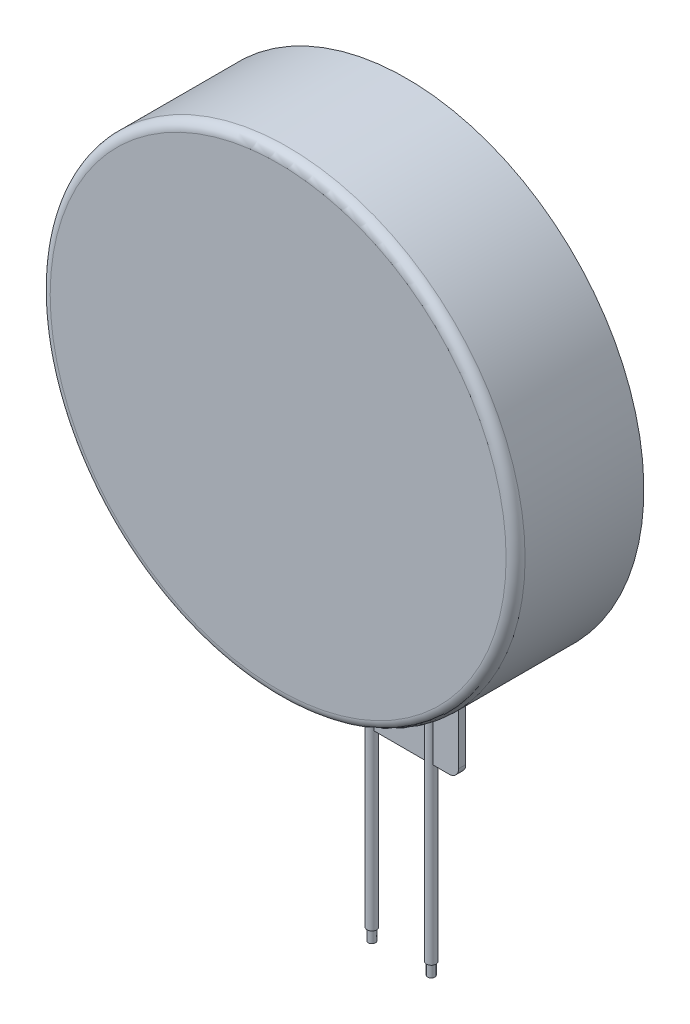
ISO-10303-21;
HEADER;
FILE_DESCRIPTION(('STEP AP214'),'2;1');
FILE_NAME('part.step','',(''),(''),'','','');
FILE_SCHEMA(('AUTOMOTIVE_DESIGN { 1 0 10303 214 1 1 1 1 }'));
ENDSEC;
DATA;
#1=APPLICATION_CONTEXT('core data for automotive mechanical design processes');
#2=APPLICATION_PROTOCOL_DEFINITION('international standard','automotive_design',2000,#1);
#3=PRODUCT_CONTEXT('',#1,'mechanical');
#4=PRODUCT('Part','Part','',(#3));
#5=PRODUCT_RELATED_PRODUCT_CATEGORY('part','',(#4));
#6=PRODUCT_DEFINITION_FORMATION('','',#4);
#7=PRODUCT_DEFINITION_CONTEXT('part definition',#1,'design');
#8=PRODUCT_DEFINITION('design','',#6,#7);
#9=PRODUCT_DEFINITION_SHAPE('','',#8);
#10=(LENGTH_UNIT() NAMED_UNIT(*) SI_UNIT(.MILLI.,.METRE.));
#11=(NAMED_UNIT(*) PLANE_ANGLE_UNIT() SI_UNIT($,.RADIAN.));
#12=(NAMED_UNIT(*) SI_UNIT($,.STERADIAN.) SOLID_ANGLE_UNIT());
#13=UNCERTAINTY_MEASURE_WITH_UNIT(LENGTH_MEASURE(1.E-05),#10,'distance_accuracy_value','');
#14=(GEOMETRIC_REPRESENTATION_CONTEXT(3) GLOBAL_UNCERTAINTY_ASSIGNED_CONTEXT((#13)) GLOBAL_UNIT_ASSIGNED_CONTEXT((#10,
#11,#12)) REPRESENTATION_CONTEXT('',''));
#15=CARTESIAN_POINT('',(0.,0.,0.));
#16=DIRECTION('',(0.,0.,1.));
#17=DIRECTION('',(1.,0.,0.));
#18=AXIS2_PLACEMENT_3D('',#15,#16,#17);
#19=CARTESIAN_POINT('',(0.625,-4.89122918275927,0.101));
#20=DIRECTION('',(0.,-1.,0.));
#21=DIRECTION('',(0.,0.,-1.));
#22=AXIS2_PLACEMENT_3D('',#19,#20,#21);
#23=CYLINDRICAL_SURFACE('',#22,0.101);
#24=CARTESIAN_POINT('',(0.625,-4.89122918275927,0.101));
#25=DIRECTION('',(0.,-1.,0.));
#26=DIRECTION('',(0.,0.,-1.));
#27=AXIS2_PLACEMENT_3D('',#24,#25,#26);
#28=CIRCLE('',#27,0.101);
#29=CARTESIAN_POINT('',(0.625,-4.89122918275927,0.));
#30=VERTEX_POINT('',#29);
#31=EDGE_CURVE('E12',#30,#30,#28,.T.);
#32=ORIENTED_EDGE('',*,*,#31,.T.);
#33=EDGE_LOOP('',(#32));
#34=FACE_BOUND('',#33,.T.);
#35=CARTESIAN_POINT('',(0.625,-10.7412291827593,0.101));
#36=DIRECTION('',(0.,-1.,0.));
#37=DIRECTION('',(0.,0.,-1.));
#38=AXIS2_PLACEMENT_3D('',#35,#36,#37);
#39=CIRCLE('',#38,0.101);
#40=CARTESIAN_POINT('',(0.625,-10.7412291827593,0.));
#41=VERTEX_POINT('',#40);
#42=EDGE_CURVE('E51',#41,#41,#39,.F.);
#43=ORIENTED_EDGE('',*,*,#42,.T.);
#44=EDGE_LOOP('',(#43));
#45=FACE_BOUND('',#44,.T.);
#46=ADVANCED_FACE('F48',(#34,#45),#23,.T.);
#47=CARTESIAN_POINT('',(0.625,-4.89122918275927,0.101));
#48=DIRECTION('',(0.,-1.,0.));
#49=DIRECTION('',(0.,0.,-1.));
#50=AXIS2_PLACEMENT_3D('',#47,#48,#49);
#51=PLANE('',#50);
#52=ORIENTED_EDGE('',*,*,#31,.F.);
#53=EDGE_LOOP('',(#52));
#54=FACE_BOUND('',#53,.T.);
#55=ADVANCED_FACE('F71',(#54),#51,.F.);
#56=CARTESIAN_POINT('',(0.,-10.7412291827593,1.35));
#57=DIRECTION('',(0.,-1.,0.));
#58=DIRECTION('',(0.,0.,-1.));
#59=AXIS2_PLACEMENT_3D('',#56,#57,#58);
#60=PLANE('',#59);
#61=ORIENTED_EDGE('',*,*,#42,.F.);
#62=EDGE_LOOP('',(#61));
#63=FACE_BOUND('',#62,.T.);
#64=CARTESIAN_POINT('',(0.625,-10.7412291827593,0.101));
#65=DIRECTION('',(0.,-1.,0.));
#66=DIRECTION('',(0.,0.,-1.));
#67=AXIS2_PLACEMENT_3D('',#64,#65,#66);
#68=CIRCLE('',#67,0.075);
#69=CARTESIAN_POINT('',(0.625,-10.7412291827593,0.026));
#70=VERTEX_POINT('',#69);
#71=EDGE_CURVE('E58',#70,#70,#68,.T.);
#72=ORIENTED_EDGE('',*,*,#71,.F.);
#73=EDGE_LOOP('',(#72));
#74=FACE_BOUND('',#73,.T.);
#75=ADVANCED_FACE('F69',(#63,#74),#60,.T.);
#76=CARTESIAN_POINT('',(0.625,-10.7412291827593,0.101));
#77=DIRECTION('',(0.,-1.,0.));
#78=DIRECTION('',(0.,0.,-1.));
#79=AXIS2_PLACEMENT_3D('',#76,#77,#78);
#80=CYLINDRICAL_SURFACE('',#79,0.075);
#81=ORIENTED_EDGE('',*,*,#71,.T.);
#82=EDGE_LOOP('',(#81));
#83=FACE_BOUND('',#82,.T.);
#84=CARTESIAN_POINT('',(0.625,-10.9912291827593,0.101));
#85=DIRECTION('',(0.,-1.,0.));
#86=DIRECTION('',(0.,0.,-1.));
#87=AXIS2_PLACEMENT_3D('',#84,#85,#86);
#88=CIRCLE('',#87,0.075);
#89=CARTESIAN_POINT('',(0.625,-10.9912291827593,0.026));
#90=VERTEX_POINT('',#89);
#91=EDGE_CURVE('E60',#90,#90,#88,.T.);
#92=ORIENTED_EDGE('',*,*,#91,.F.);
#93=EDGE_LOOP('',(#92));
#94=FACE_BOUND('',#93,.T.);
#95=ADVANCED_FACE('F66',(#83,#94),#80,.T.);
#96=CARTESIAN_POINT('',(0.625,-10.9912291827593,0.101));
#97=DIRECTION('',(0.,-1.,0.));
#98=DIRECTION('',(0.,0.,-1.));
#99=AXIS2_PLACEMENT_3D('',#96,#97,#98);
#100=PLANE('',#99);
#101=ORIENTED_EDGE('',*,*,#91,.T.);
#102=EDGE_LOOP('',(#101));
#103=FACE_BOUND('',#102,.T.);
#104=ADVANCED_FACE('F78',(#103),#100,.T.);
#105=CLOSED_SHELL('',(#46,#55,#75,#95,#104));
#106=MANIFOLD_SOLID_BREP('B2',#105);
#107=CARTESIAN_POINT('',(-0.625,-4.89122918275927,0.101));
#108=DIRECTION('',(0.,-1.,0.));
#109=DIRECTION('',(0.,0.,-1.));
#110=AXIS2_PLACEMENT_3D('',#107,#108,#109);
#111=CYLINDRICAL_SURFACE('',#110,0.101);
#112=CARTESIAN_POINT('',(-0.625,-4.89122918275927,0.101));
#113=DIRECTION('',(0.,-1.,0.));
#114=DIRECTION('',(0.,0.,-1.));
#115=AXIS2_PLACEMENT_3D('',#112,#113,#114);
#116=CIRCLE('',#115,0.101);
#117=CARTESIAN_POINT('',(-0.625,-4.89122918275927,0.));
#118=VERTEX_POINT('',#117);
#119=EDGE_CURVE('E47',#118,#118,#116,.T.);
#120=ORIENTED_EDGE('',*,*,#119,.T.);
#121=EDGE_LOOP('',(#120));
#122=FACE_BOUND('',#121,.T.);
#123=CARTESIAN_POINT('',(-0.625,-10.7412291827593,0.101));
#124=DIRECTION('',(0.,-1.,0.));
#125=DIRECTION('',(0.,0.,-1.));
#126=AXIS2_PLACEMENT_3D('',#123,#124,#125);
#127=CIRCLE('',#126,0.101);
#128=CARTESIAN_POINT('',(-0.625,-10.7412291827593,0.));
#129=VERTEX_POINT('',#128);
#130=EDGE_CURVE('E148',#129,#129,#127,.F.);
#131=ORIENTED_EDGE('',*,*,#130,.T.);
#132=EDGE_LOOP('',(#131));
#133=FACE_BOUND('',#132,.T.);
#134=ADVANCED_FACE('F145',(#122,#133),#111,.T.);
#135=CARTESIAN_POINT('',(-0.625,-4.89122918275927,0.101));
#136=DIRECTION('',(0.,-1.,0.));
#137=DIRECTION('',(0.,0.,-1.));
#138=AXIS2_PLACEMENT_3D('',#135,#136,#137);
#139=PLANE('',#138);
#140=ORIENTED_EDGE('',*,*,#119,.F.);
#141=EDGE_LOOP('',(#140));
#142=FACE_BOUND('',#141,.T.);
#143=ADVANCED_FACE('F168',(#142),#139,.F.);
#144=CARTESIAN_POINT('',(0.,-10.7412291827593,1.35));
#145=DIRECTION('',(0.,-1.,0.));
#146=DIRECTION('',(0.,0.,-1.));
#147=AXIS2_PLACEMENT_3D('',#144,#145,#146);
#148=PLANE('',#147);
#149=ORIENTED_EDGE('',*,*,#130,.F.);
#150=EDGE_LOOP('',(#149));
#151=FACE_BOUND('',#150,.T.);
#152=CARTESIAN_POINT('',(-0.625,-10.7412291827593,0.101));
#153=DIRECTION('',(0.,-1.,0.));
#154=DIRECTION('',(0.,0.,-1.));
#155=AXIS2_PLACEMENT_3D('',#152,#153,#154);
#156=CIRCLE('',#155,0.075);
#157=CARTESIAN_POINT('',(-0.625,-10.7412291827593,0.026));
#158=VERTEX_POINT('',#157);
#159=EDGE_CURVE('E155',#158,#158,#156,.T.);
#160=ORIENTED_EDGE('',*,*,#159,.F.);
#161=EDGE_LOOP('',(#160));
#162=FACE_BOUND('',#161,.T.);
#163=ADVANCED_FACE('F166',(#151,#162),#148,.T.);
#164=CARTESIAN_POINT('',(-0.625,-10.7412291827593,0.101));
#165=DIRECTION('',(0.,-1.,0.));
#166=DIRECTION('',(0.,0.,-1.));
#167=AXIS2_PLACEMENT_3D('',#164,#165,#166);
#168=CYLINDRICAL_SURFACE('',#167,0.075);
#169=ORIENTED_EDGE('',*,*,#159,.T.);
#170=EDGE_LOOP('',(#169));
#171=FACE_BOUND('',#170,.T.);
#172=CARTESIAN_POINT('',(-0.625,-10.9912291827593,0.101));
#173=DIRECTION('',(0.,-1.,0.));
#174=DIRECTION('',(0.,0.,-1.));
#175=AXIS2_PLACEMENT_3D('',#172,#173,#174);
#176=CIRCLE('',#175,0.075);
#177=CARTESIAN_POINT('',(-0.625,-10.9912291827593,0.026));
#178=VERTEX_POINT('',#177);
#179=EDGE_CURVE('E157',#178,#178,#176,.T.);
#180=ORIENTED_EDGE('',*,*,#179,.F.);
#181=EDGE_LOOP('',(#180));
#182=FACE_BOUND('',#181,.T.);
#183=ADVANCED_FACE('F163',(#171,#182),#168,.T.);
#184=CARTESIAN_POINT('',(-0.625,-10.9912291827593,0.101));
#185=DIRECTION('',(0.,-1.,0.));
#186=DIRECTION('',(0.,0.,-1.));
#187=AXIS2_PLACEMENT_3D('',#184,#185,#186);
#188=PLANE('',#187);
#189=ORIENTED_EDGE('',*,*,#179,.T.);
#190=EDGE_LOOP('',(#189));
#191=FACE_BOUND('',#190,.T.);
#192=ADVANCED_FACE('F175',(#191),#188,.T.);
#193=CLOSED_SHELL('',(#134,#143,#163,#183,#192));
#194=MANIFOLD_SOLID_BREP('B7',#193);
#195=CARTESIAN_POINT('',(0.,0.,2.7));
#196=DIRECTION('',(0.,0.,-1.));
#197=DIRECTION('',(-1.,0.,0.));
#198=AXIS2_PLACEMENT_3D('',#195,#196,#197);
#199=CYLINDRICAL_SURFACE('',#198,5.);
#200=CARTESIAN_POINT('',(0.,0.,2.5));
#201=DIRECTION('',(0.,0.,1.));
#202=DIRECTION('',(1.,0.,0.));
#203=AXIS2_PLACEMENT_3D('',#200,#201,#202);
#204=CIRCLE('',#203,5.);
#205=CARTESIAN_POINT('',(5.,0.,2.5));
#206=VERTEX_POINT('',#205);
#207=EDGE_CURVE('E143',#206,#206,#204,.F.);
#208=ORIENTED_EDGE('',*,*,#207,.T.);
#209=EDGE_LOOP('',(#208));
#210=FACE_BOUND('',#209,.T.);
#211=CARTESIAN_POINT('',(0.,0.,0.));
#212=DIRECTION('',(0.,0.,1.));
#213=DIRECTION('',(1.,0.,0.));
#214=AXIS2_PLACEMENT_3D('',#211,#212,#213);
#215=CIRCLE('',#214,5.);
#216=CARTESIAN_POINT('',(1.25,-4.84122918275927,0.));
#217=VERTEX_POINT('',#216);
#218=CARTESIAN_POINT('',(-1.25,-4.84122918275927,0.));
#219=VERTEX_POINT('',#218);
#220=EDGE_CURVE('E291',#217,#219,#215,.T.);
#221=ORIENTED_EDGE('',*,*,#220,.T.);
#222=DIRECTION('',(0.,0.,-1.));
#223=VECTOR('',#222,1.);
#224=CARTESIAN_POINT('',(-1.25,-4.84122918275927,2.7));
#225=LINE('',#224,#223);
#226=CARTESIAN_POINT('',(-1.25,-4.84122918275927,0.15));
#227=VERTEX_POINT('',#226);
#228=EDGE_CURVE('E303',#219,#227,#225,.F.);
#229=ORIENTED_EDGE('',*,*,#228,.T.);
#230=CARTESIAN_POINT('',(0.,0.,0.15));
#231=DIRECTION('',(0.,0.,1.));
#232=DIRECTION('',(1.,0.,0.));
#233=AXIS2_PLACEMENT_3D('',#230,#231,#232);
#234=CIRCLE('',#233,5.);
#235=CARTESIAN_POINT('',(1.25,-4.84122918275927,0.15));
#236=VERTEX_POINT('',#235);
#237=EDGE_CURVE('E302',#227,#236,#234,.T.);
#238=ORIENTED_EDGE('',*,*,#237,.T.);
#239=DIRECTION('',(0.,0.,-1.));
#240=VECTOR('',#239,1.);
#241=CARTESIAN_POINT('',(1.25,-4.84122918275927,2.7));
#242=LINE('',#241,#240);
#243=EDGE_CURVE('E306',#236,#217,#242,.T.);
#244=ORIENTED_EDGE('',*,*,#243,.T.);
#245=EDGE_LOOP('',(#221,#229,#238,#244));
#246=FACE_BOUND('',#245,.T.);
#247=ADVANCED_FACE('F234',(#210,#246),#199,.T.);
#248=CARTESIAN_POINT('',(0.,0.,2.7));
#249=DIRECTION('',(0.,0.,1.));
#250=DIRECTION('',(1.,0.,0.));
#251=AXIS2_PLACEMENT_3D('',#248,#249,#250);
#252=PLANE('',#251);
#253=CARTESIAN_POINT('',(0.,0.,2.7));
#254=DIRECTION('',(0.,0.,1.));
#255=DIRECTION('',(1.,0.,0.));
#256=AXIS2_PLACEMENT_3D('',#253,#254,#255);
#257=CIRCLE('',#256,4.8);
#258=CARTESIAN_POINT('',(4.8,0.,2.7));
#259=VERTEX_POINT('',#258);
#260=EDGE_CURVE('E243',#259,#259,#257,.T.);
#261=ORIENTED_EDGE('',*,*,#260,.T.);
#262=EDGE_LOOP('',(#261));
#263=FACE_BOUND('',#262,.T.);
#264=ADVANCED_FACE('F356',(#263),#252,.T.);
#265=CARTESIAN_POINT('',(0.,0.,0.));
#266=DIRECTION('',(0.,0.,1.));
#267=DIRECTION('',(1.,0.,0.));
#268=AXIS2_PLACEMENT_3D('',#265,#266,#267);
#269=PLANE('',#268);
#270=DIRECTION('',(-1.,0.,0.));
#271=VECTOR('',#270,1.);
#272=CARTESIAN_POINT('',(-1.25,-7.09122918275927,0.));
#273=LINE('',#272,#271);
#274=CARTESIAN_POINT('',(1.05,-7.09122918275927,0.));
#275=VERTEX_POINT('',#274);
#276=CARTESIAN_POINT('',(-1.05,-7.09122918275927,0.));
#277=VERTEX_POINT('',#276);
#278=EDGE_CURVE('E317',#275,#277,#273,.T.);
#279=ORIENTED_EDGE('',*,*,#278,.T.);
#280=CARTESIAN_POINT('',(-1.05,-6.89122918275927,0.));
#281=DIRECTION('',(0.,0.,1.));
#282=DIRECTION('',(1.,0.,0.));
#283=AXIS2_PLACEMENT_3D('',#280,#281,#282);
#284=CIRCLE('',#283,0.2);
#285=CARTESIAN_POINT('',(-1.25,-6.89122918275927,0.));
#286=VERTEX_POINT('',#285);
#287=EDGE_CURVE('E341',#277,#286,#284,.F.);
#288=ORIENTED_EDGE('',*,*,#287,.T.);
#289=DIRECTION('',(0.,1.,0.));
#290=VECTOR('',#289,1.);
#291=CARTESIAN_POINT('',(-1.25,-4.84122918275927,0.));
#292=LINE('',#291,#290);
#293=EDGE_CURVE('E297',#286,#219,#292,.T.);
#294=ORIENTED_EDGE('',*,*,#293,.T.);
#295=ORIENTED_EDGE('',*,*,#220,.F.);
#296=DIRECTION('',(0.,-1.,0.));
#297=VECTOR('',#296,1.);
#298=CARTESIAN_POINT('',(1.25,-4.84122918275927,0.));
#299=LINE('',#298,#297);
#300=CARTESIAN_POINT('',(1.25,-6.89122918275927,0.));
#301=VERTEX_POINT('',#300);
#302=EDGE_CURVE('E296',#217,#301,#299,.T.);
#303=ORIENTED_EDGE('',*,*,#302,.T.);
#304=CARTESIAN_POINT('',(1.05,-6.89122918275927,0.));
#305=DIRECTION('',(0.,0.,1.));
#306=DIRECTION('',(1.,0.,0.));
#307=AXIS2_PLACEMENT_3D('',#304,#305,#306);
#308=CIRCLE('',#307,0.2);
#309=EDGE_CURVE('E338',#301,#275,#308,.F.);
#310=ORIENTED_EDGE('',*,*,#309,.T.);
#311=EDGE_LOOP('',(#279,#288,#294,#295,#303,#310));
#312=FACE_BOUND('',#311,.T.);
#313=ADVANCED_FACE('F294',(#312),#269,.F.);
#314=CARTESIAN_POINT('',(0.,0.,0.15));
#315=DIRECTION('',(0.,0.,1.));
#316=DIRECTION('',(1.,0.,0.));
#317=AXIS2_PLACEMENT_3D('',#314,#315,#316);
#318=PLANE('',#317);
#319=DIRECTION('',(0.,1.,0.));
#320=VECTOR('',#319,1.);
#321=CARTESIAN_POINT('',(-1.25,-4.84122918275927,0.15));
#322=LINE('',#321,#320);
#323=CARTESIAN_POINT('',(-1.25,-6.89122918275927,0.15));
#324=VERTEX_POINT('',#323);
#325=EDGE_CURVE('E310',#324,#227,#322,.T.);
#326=ORIENTED_EDGE('',*,*,#325,.F.);
#327=CARTESIAN_POINT('',(-1.05,-6.89122918275927,0.15));
#328=DIRECTION('',(0.,0.,1.));
#329=DIRECTION('',(1.,0.,0.));
#330=AXIS2_PLACEMENT_3D('',#327,#328,#329);
#331=CIRCLE('',#330,0.2);
#332=CARTESIAN_POINT('',(-1.05,-7.09122918275927,0.15));
#333=VERTEX_POINT('',#332);
#334=EDGE_CURVE('E348',#324,#333,#331,.T.);
#335=ORIENTED_EDGE('',*,*,#334,.T.);
#336=DIRECTION('',(-1.,0.,0.));
#337=VECTOR('',#336,1.);
#338=CARTESIAN_POINT('',(-1.25,-7.09122918275927,0.15));
#339=LINE('',#338,#337);
#340=CARTESIAN_POINT('',(1.05,-7.09122918275927,0.15));
#341=VERTEX_POINT('',#340);
#342=EDGE_CURVE('E388',#341,#333,#339,.T.);
#343=ORIENTED_EDGE('',*,*,#342,.F.);
#344=CARTESIAN_POINT('',(1.05,-6.89122918275927,0.15));
#345=DIRECTION('',(0.,0.,1.));
#346=DIRECTION('',(1.,0.,0.));
#347=AXIS2_PLACEMENT_3D('',#344,#345,#346);
#348=CIRCLE('',#347,0.2);
#349=CARTESIAN_POINT('',(1.25,-6.89122918275927,0.15));
#350=VERTEX_POINT('',#349);
#351=EDGE_CURVE('E250',#341,#350,#348,.T.);
#352=ORIENTED_EDGE('',*,*,#351,.T.);
#353=DIRECTION('',(0.,-1.,0.));
#354=VECTOR('',#353,1.);
#355=CARTESIAN_POINT('',(1.25,-4.17973326244027,0.15));
#356=LINE('',#355,#354);
#357=EDGE_CURVE('E325',#236,#350,#356,.T.);
#358=ORIENTED_EDGE('',*,*,#357,.F.);
#359=ORIENTED_EDGE('',*,*,#237,.F.);
#360=EDGE_LOOP('',(#326,#335,#343,#352,#358,#359));
#361=FACE_BOUND('',#360,.T.);
#362=ADVANCED_FACE('F387',(#361),#318,.T.);
#363=CARTESIAN_POINT('',(-1.25,-4.84122918275927,0.15));
#364=DIRECTION('',(-1.,0.,0.));
#365=DIRECTION('',(0.,0.,1.));
#366=AXIS2_PLACEMENT_3D('',#363,#364,#365);
#367=PLANE('',#366);
#368=ORIENTED_EDGE('',*,*,#293,.F.);
#369=DIRECTION('',(0.,0.,-1.));
#370=VECTOR('',#369,1.);
#371=CARTESIAN_POINT('',(-1.25,-6.89122918275927,0.15));
#372=LINE('',#371,#370);
#373=EDGE_CURVE('E258',#286,#324,#372,.F.);
#374=ORIENTED_EDGE('',*,*,#373,.T.);
#375=ORIENTED_EDGE('',*,*,#325,.T.);
#376=ORIENTED_EDGE('',*,*,#228,.F.);
#377=EDGE_LOOP('',(#368,#374,#375,#376));
#378=FACE_BOUND('',#377,.T.);
#379=ADVANCED_FACE('F395',(#378),#367,.T.);
#380=CARTESIAN_POINT('',(1.25,-4.84122918275927,0.15));
#381=DIRECTION('',(1.,0.,0.));
#382=DIRECTION('',(0.,1.,0.));
#383=AXIS2_PLACEMENT_3D('',#380,#381,#382);
#384=PLANE('',#383);
#385=ORIENTED_EDGE('',*,*,#357,.T.);
#386=DIRECTION('',(0.,0.,-1.));
#387=VECTOR('',#386,1.);
#388=CARTESIAN_POINT('',(1.25,-6.89122918275927,0.15));
#389=LINE('',#388,#387);
#390=EDGE_CURVE('E315',#350,#301,#389,.T.);
#391=ORIENTED_EDGE('',*,*,#390,.T.);
#392=ORIENTED_EDGE('',*,*,#302,.F.);
#393=ORIENTED_EDGE('',*,*,#243,.F.);
#394=EDGE_LOOP('',(#385,#391,#392,#393));
#395=FACE_BOUND('',#394,.T.);
#396=ADVANCED_FACE('F313',(#395),#384,.T.);
#397=CARTESIAN_POINT('',(-1.25,-7.09122918275927,0.15));
#398=DIRECTION('',(0.,-1.,0.));
#399=DIRECTION('',(0.,0.,-1.));
#400=AXIS2_PLACEMENT_3D('',#397,#398,#399);
#401=PLANE('',#400);
#402=ORIENTED_EDGE('',*,*,#342,.T.);
#403=DIRECTION('',(0.,0.,-1.));
#404=VECTOR('',#403,1.);
#405=CARTESIAN_POINT('',(-1.05,-7.09122918275927,0.15));
#406=LINE('',#405,#404);
#407=EDGE_CURVE('E334',#333,#277,#406,.T.);
#408=ORIENTED_EDGE('',*,*,#407,.T.);
#409=ORIENTED_EDGE('',*,*,#278,.F.);
#410=DIRECTION('',(0.,0.,-1.));
#411=VECTOR('',#410,1.);
#412=CARTESIAN_POINT('',(1.05,-7.09122918275927,0.15));
#413=LINE('',#412,#411);
#414=EDGE_CURVE('E331',#275,#341,#413,.F.);
#415=ORIENTED_EDGE('',*,*,#414,.T.);
#416=EDGE_LOOP('',(#402,#408,#409,#415));
#417=FACE_BOUND('',#416,.T.);
#418=ADVANCED_FACE('F377',(#417),#401,.T.);
#419=CARTESIAN_POINT('',(-1.05,-6.89122918275927,0.15));
#420=DIRECTION('',(0.,0.,-1.));
#421=DIRECTION('',(-1.,0.,0.));
#422=AXIS2_PLACEMENT_3D('',#419,#420,#421);
#423=CYLINDRICAL_SURFACE('',#422,0.2);
#424=ORIENTED_EDGE('',*,*,#334,.F.);
#425=ORIENTED_EDGE('',*,*,#373,.F.);
#426=ORIENTED_EDGE('',*,*,#287,.F.);
#427=ORIENTED_EDGE('',*,*,#407,.F.);
#428=EDGE_LOOP('',(#424,#425,#426,#427));
#429=FACE_BOUND('',#428,.T.);
#430=ADVANCED_FACE('F364',(#429),#423,.T.);
#431=CARTESIAN_POINT('',(1.05,-6.89122918275927,0.15));
#432=DIRECTION('',(0.,0.,-1.));
#433=DIRECTION('',(-1.,0.,0.));
#434=AXIS2_PLACEMENT_3D('',#431,#432,#433);
#435=CYLINDRICAL_SURFACE('',#434,0.2);
#436=ORIENTED_EDGE('',*,*,#351,.F.);
#437=ORIENTED_EDGE('',*,*,#414,.F.);
#438=ORIENTED_EDGE('',*,*,#309,.F.);
#439=ORIENTED_EDGE('',*,*,#390,.F.);
#440=EDGE_LOOP('',(#436,#437,#438,#439));
#441=FACE_BOUND('',#440,.T.);
#442=ADVANCED_FACE('F359',(#441),#435,.T.);
#443=CARTESIAN_POINT('',(0.,0.,2.5));
#444=DIRECTION('',(0.,0.,1.));
#445=DIRECTION('',(1.,0.,0.));
#446=AXIS2_PLACEMENT_3D('',#443,#444,#445);
#447=TOROIDAL_SURFACE('',#446,4.8,0.2);
#448=ORIENTED_EDGE('',*,*,#207,.F.);
#449=EDGE_LOOP('',(#448));
#450=FACE_BOUND('',#449,.T.);
#451=ORIENTED_EDGE('',*,*,#260,.F.);
#452=EDGE_LOOP('',(#451));
#453=FACE_BOUND('',#452,.T.);
#454=ADVANCED_FACE('F236',(#450,#453),#447,.T.);
#455=CLOSED_SHELL('',(#247,#264,#313,#362,#379,#396,#418,#430,#442,#454));
#456=MANIFOLD_SOLID_BREP('B42',#455);
#457=ADVANCED_BREP_SHAPE_REPRESENTATION('',(#18,#106,#194,#456),#14);
#458=SHAPE_DEFINITION_REPRESENTATION(#9,#457);
ENDSEC;
END-ISO-10303-21;
